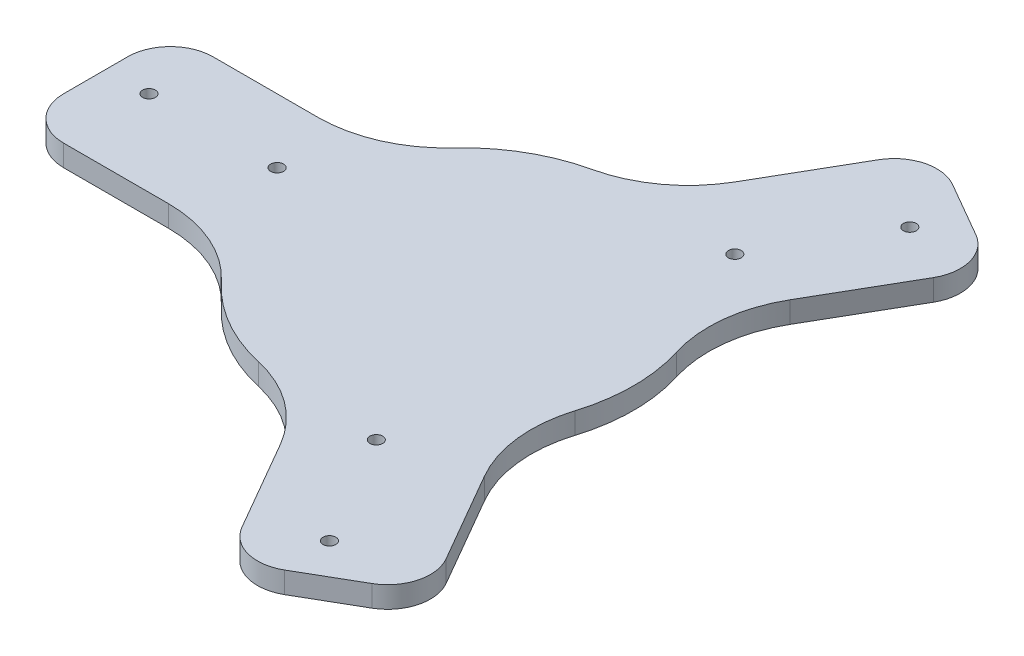
ISO-10303-21;
HEADER;
FILE_DESCRIPTION(('STEP AP214'),'2;1');
FILE_NAME('part.step','',(''),(''),'','','');
FILE_SCHEMA(('AUTOMOTIVE_DESIGN { 1 0 10303 214 1 1 1 1 }'));
ENDSEC;
DATA;
#1=APPLICATION_CONTEXT('core data for automotive mechanical design processes');
#2=APPLICATION_PROTOCOL_DEFINITION('international standard','automotive_design',2000,#1);
#3=PRODUCT_CONTEXT('',#1,'mechanical');
#4=PRODUCT('Part','Part','',(#3));
#5=PRODUCT_RELATED_PRODUCT_CATEGORY('part','',(#4));
#6=PRODUCT_DEFINITION_FORMATION('','',#4);
#7=PRODUCT_DEFINITION_CONTEXT('part definition',#1,'design');
#8=PRODUCT_DEFINITION('design','',#6,#7);
#9=PRODUCT_DEFINITION_SHAPE('','',#8);
#10=(LENGTH_UNIT() NAMED_UNIT(*) SI_UNIT(.MILLI.,.METRE.));
#11=(NAMED_UNIT(*) PLANE_ANGLE_UNIT() SI_UNIT($,.RADIAN.));
#12=(NAMED_UNIT(*) SI_UNIT($,.STERADIAN.) SOLID_ANGLE_UNIT());
#13=UNCERTAINTY_MEASURE_WITH_UNIT(LENGTH_MEASURE(1.E-05),#10,'distance_accuracy_value','');
#14=(GEOMETRIC_REPRESENTATION_CONTEXT(3) GLOBAL_UNCERTAINTY_ASSIGNED_CONTEXT((#13)) GLOBAL_UNIT_ASSIGNED_CONTEXT((#10,
#11,#12)) REPRESENTATION_CONTEXT('',''));
#15=CARTESIAN_POINT('',(0.,0.,0.));
#16=DIRECTION('',(0.,0.,1.));
#17=DIRECTION('',(1.,0.,0.));
#18=AXIS2_PLACEMENT_3D('',#15,#16,#17);
#19=CARTESIAN_POINT('',(-75.9687364248454,5.,7.5));
#20=DIRECTION('',(0.,-1.,0.));
#21=DIRECTION('',(0.,0.,-1.));
#22=AXIS2_PLACEMENT_3D('',#19,#20,#21);
#23=PLANE('',#22);
#24=CARTESIAN_POINT('',(-75.9687364248454,5.,7.5));
#25=DIRECTION('',(0.,1.,0.));
#26=DIRECTION('',(0.,0.,-1.));
#27=AXIS2_PLACEMENT_3D('',#24,#25,#26);
#28=CIRCLE('',#27,10.);
#29=CARTESIAN_POINT('',(-85.9687364248454,5.,7.5));
#30=VERTEX_POINT('',#29);
#31=CARTESIAN_POINT('',(-75.9687364248454,5.,17.5));
#32=VERTEX_POINT('',#31);
#33=EDGE_CURVE('E276',#30,#32,#28,.T.);
#34=ORIENTED_EDGE('',*,*,#33,.T.);
#35=DIRECTION('',(1.,0.,0.));
#36=VECTOR('',#35,1.);
#37=CARTESIAN_POINT('',(-51.4174095030078,5.,17.5));
#38=LINE('',#37,#36);
#39=CARTESIAN_POINT('',(-51.4174095030078,5.,17.5));
#40=VERTEX_POINT('',#39);
#41=EDGE_CURVE('E144',#32,#40,#38,.T.);
#42=ORIENTED_EDGE('',*,*,#41,.T.);
#43=CARTESIAN_POINT('',(-51.4174095030078,5.,47.5));
#44=DIRECTION('',(0.,-1.,0.));
#45=DIRECTION('',(0.,0.,1.));
#46=AXIS2_PLACEMENT_3D('',#43,#44,#45);
#47=CIRCLE('',#46,30.);
#48=CARTESIAN_POINT('',(-29.3813768588616,5.,27.1428571428571));
#49=VERTEX_POINT('',#48);
#50=EDGE_CURVE('E339',#40,#49,#47,.T.);
#51=ORIENTED_EDGE('',*,*,#50,.T.);
#52=CARTESIAN_POINT('',(0.,5.,0.));
#53=DIRECTION('',(0.,1.,0.));
#54=DIRECTION('',(0.,0.,1.));
#55=AXIS2_PLACEMENT_3D('',#52,#53,#54);
#56=CIRCLE('',#55,40.);
#57=CARTESIAN_POINT('',(-8.81571538757538,5.,39.016447329367));
#58=VERTEX_POINT('',#57);
#59=EDGE_CURVE('E358',#49,#58,#56,.T.);
#60=ORIENTED_EDGE('',*,*,#59,.T.);
#61=CARTESIAN_POINT('',(-15.4275019282569,5.,68.2787828263922));
#62=DIRECTION('',(0.,-1.,0.));
#63=DIRECTION('',(0.,0.,-1.));
#64=AXIS2_PLACEMENT_3D('',#61,#62,#63);
#65=CIRCLE('',#64,30.);
#66=CARTESIAN_POINT('',(10.5532601852763,5.,53.2787828263922));
#67=VERTEX_POINT('',#66);
#68=EDGE_CURVE('E355',#58,#67,#65,.T.);
#69=ORIENTED_EDGE('',*,*,#68,.T.);
#70=DIRECTION('',(0.500000000000001,0.,0.866025403784438));
#71=VECTOR('',#70,1.);
#72=CARTESIAN_POINT('',(10.5532601852763,5.,53.2787828263922));
#73=LINE('',#72,#71);
#74=CARTESIAN_POINT('',(22.8289236461951,5.,74.5408556373203));
#75=VERTEX_POINT('',#74);
#76=EDGE_CURVE('E357',#67,#75,#73,.T.);
#77=ORIENTED_EDGE('',*,*,#76,.T.);
#78=CARTESIAN_POINT('',(31.4891776840394,5.,69.5408556373203));
#79=DIRECTION('',(0.,1.,0.));
#80=DIRECTION('',(0.,0.,1.));
#81=AXIS2_PLACEMENT_3D('',#78,#79,#80);
#82=CIRCLE('',#81,10.);
#83=CARTESIAN_POINT('',(36.4891776840394,5.,78.2011096751647));
#84=VERTEX_POINT('',#83);
#85=EDGE_CURVE('E360',#75,#84,#82,.T.);
#86=ORIENTED_EDGE('',*,*,#85,.T.);
#87=DIRECTION('',(0.866025403784439,0.,-0.5));
#88=VECTOR('',#87,1.);
#89=CARTESIAN_POINT('',(49.479558740806,5.,70.7011096751647));
#90=LINE('',#89,#88);
#91=CARTESIAN_POINT('',(49.479558740806,5.,70.7011096751647));
#92=VERTEX_POINT('',#91);
#93=EDGE_CURVE('E366',#84,#92,#90,.T.);
#94=ORIENTED_EDGE('',*,*,#93,.T.);
#95=CARTESIAN_POINT('',(44.479558740806,5.,62.0408556373203));
#96=DIRECTION('',(0.,1.,0.));
#97=DIRECTION('',(0.,0.,-1.));
#98=AXIS2_PLACEMENT_3D('',#95,#96,#97);
#99=CIRCLE('',#98,9.99999999999999);
#100=CARTESIAN_POINT('',(53.1398127786504,5.,57.0408556373203));
#101=VERTEX_POINT('',#100);
#102=EDGE_CURVE('E368',#92,#101,#99,.T.);
#103=ORIENTED_EDGE('',*,*,#102,.T.);
#104=DIRECTION('',(-0.5,0.,-0.866025403784439));
#105=VECTOR('',#104,1.);
#106=CARTESIAN_POINT('',(40.8641493177316,5.,35.7787828263922));
#107=LINE('',#106,#105);
#108=CARTESIAN_POINT('',(40.8641493177316,5.,35.7787828263922));
#109=VERTEX_POINT('',#108);
#110=EDGE_CURVE('E370',#101,#109,#107,.T.);
#111=ORIENTED_EDGE('',*,*,#110,.T.);
#112=CARTESIAN_POINT('',(66.8449114312648,5.,20.7787828263922));
#113=DIRECTION('',(0.,-1.,0.));
#114=DIRECTION('',(0.,0.,1.));
#115=AXIS2_PLACEMENT_3D('',#112,#113,#114);
#116=CIRCLE('',#115,30.);
#117=CARTESIAN_POINT('',(38.197092246437,5.,11.8735901865098));
#118=VERTEX_POINT('',#117);
#119=EDGE_CURVE('E372',#109,#118,#116,.T.);
#120=ORIENTED_EDGE('',*,*,#119,.T.);
#121=CARTESIAN_POINT('',(0.,5.,0.));
#122=DIRECTION('',(0.,1.,0.));
#123=DIRECTION('',(0.,0.,1.));
#124=AXIS2_PLACEMENT_3D('',#121,#122,#123);
#125=CIRCLE('',#124,40.);
#126=CARTESIAN_POINT('',(38.197092246437,5.,-11.8735901865098));
#127=VERTEX_POINT('',#126);
#128=EDGE_CURVE('E374',#118,#127,#125,.T.);
#129=ORIENTED_EDGE('',*,*,#128,.T.);
#130=CARTESIAN_POINT('',(66.8449114312647,5.,-20.7787828263922));
#131=DIRECTION('',(0.,-1.,0.));
#132=DIRECTION('',(0.,0.,-1.));
#133=AXIS2_PLACEMENT_3D('',#130,#131,#132);
#134=CIRCLE('',#133,30.);
#135=CARTESIAN_POINT('',(40.8641493177316,5.,-35.7787828263922));
#136=VERTEX_POINT('',#135);
#137=EDGE_CURVE('E376',#127,#136,#134,.T.);
#138=ORIENTED_EDGE('',*,*,#137,.T.);
#139=DIRECTION('',(0.5,0.,-0.866025403784439));
#140=VECTOR('',#139,1.);
#141=CARTESIAN_POINT('',(40.8641493177316,5.,-35.7787828263922));
#142=LINE('',#141,#140);
#143=CARTESIAN_POINT('',(53.1398127786504,5.,-57.0408556373203));
#144=VERTEX_POINT('',#143);
#145=EDGE_CURVE('E378',#136,#144,#142,.T.);
#146=ORIENTED_EDGE('',*,*,#145,.T.);
#147=CARTESIAN_POINT('',(44.479558740806,5.,-62.0408556373203));
#148=DIRECTION('',(0.,1.,0.));
#149=DIRECTION('',(0.,0.,1.));
#150=AXIS2_PLACEMENT_3D('',#147,#148,#149);
#151=CIRCLE('',#150,9.99999999999999);
#152=CARTESIAN_POINT('',(49.479558740806,5.,-70.7011096751647));
#153=VERTEX_POINT('',#152);
#154=EDGE_CURVE('E380',#144,#153,#151,.T.);
#155=ORIENTED_EDGE('',*,*,#154,.T.);
#156=DIRECTION('',(-0.866025403784439,0.,-0.5));
#157=VECTOR('',#156,1.);
#158=CARTESIAN_POINT('',(36.4891776840394,5.,-78.2011096751647));
#159=LINE('',#158,#157);
#160=CARTESIAN_POINT('',(36.4891776840394,5.,-78.2011096751647));
#161=VERTEX_POINT('',#160);
#162=EDGE_CURVE('E382',#153,#161,#159,.T.);
#163=ORIENTED_EDGE('',*,*,#162,.T.);
#164=CARTESIAN_POINT('',(31.4891776840394,5.,-69.5408556373203));
#165=DIRECTION('',(0.,1.,0.));
#166=DIRECTION('',(0.,0.,-1.));
#167=AXIS2_PLACEMENT_3D('',#164,#165,#166);
#168=CIRCLE('',#167,9.99999999999999);
#169=CARTESIAN_POINT('',(22.828923646195,5.,-74.5408556373203));
#170=VERTEX_POINT('',#169);
#171=EDGE_CURVE('E384',#161,#170,#168,.T.);
#172=ORIENTED_EDGE('',*,*,#171,.T.);
#173=DIRECTION('',(-0.5,0.,0.866025403784439));
#174=VECTOR('',#173,1.);
#175=CARTESIAN_POINT('',(10.5532601852762,5.,-53.2787828263922));
#176=LINE('',#175,#174);
#177=CARTESIAN_POINT('',(10.5532601852762,5.,-53.2787828263922));
#178=VERTEX_POINT('',#177);
#179=EDGE_CURVE('E386',#170,#178,#176,.T.);
#180=ORIENTED_EDGE('',*,*,#179,.T.);
#181=CARTESIAN_POINT('',(-15.4275019282569,5.,-68.2787828263922));
#182=DIRECTION('',(0.,-1.,0.));
#183=DIRECTION('',(0.,0.,1.));
#184=AXIS2_PLACEMENT_3D('',#181,#182,#183);
#185=CIRCLE('',#184,30.);
#186=CARTESIAN_POINT('',(-8.8157153875754,5.,-39.016447329367));
#187=VERTEX_POINT('',#186);
#188=EDGE_CURVE('E388',#178,#187,#185,.T.);
#189=ORIENTED_EDGE('',*,*,#188,.T.);
#190=CARTESIAN_POINT('',(0.,5.,0.));
#191=DIRECTION('',(0.,1.,0.));
#192=DIRECTION('',(0.,0.,1.));
#193=AXIS2_PLACEMENT_3D('',#190,#191,#192);
#194=CIRCLE('',#193,40.);
#195=CARTESIAN_POINT('',(-29.3813768588616,5.,-27.1428571428572));
#196=VERTEX_POINT('',#195);
#197=EDGE_CURVE('E390',#187,#196,#194,.T.);
#198=ORIENTED_EDGE('',*,*,#197,.T.);
#199=CARTESIAN_POINT('',(-51.4174095030078,5.,-47.5));
#200=DIRECTION('',(0.,-1.,0.));
#201=DIRECTION('',(0.,0.,-1.));
#202=AXIS2_PLACEMENT_3D('',#199,#200,#201);
#203=CIRCLE('',#202,30.);
#204=CARTESIAN_POINT('',(-51.4174095030078,5.,-17.5));
#205=VERTEX_POINT('',#204);
#206=EDGE_CURVE('E211',#196,#205,#203,.T.);
#207=ORIENTED_EDGE('',*,*,#206,.T.);
#208=DIRECTION('',(-1.,0.,0.));
#209=VECTOR('',#208,1.);
#210=CARTESIAN_POINT('',(-51.4174095030078,5.,-17.5));
#211=LINE('',#210,#209);
#212=CARTESIAN_POINT('',(-75.9687364248454,5.,-17.5));
#213=VERTEX_POINT('',#212);
#214=EDGE_CURVE('E205',#205,#213,#211,.T.);
#215=ORIENTED_EDGE('',*,*,#214,.T.);
#216=CARTESIAN_POINT('',(-75.9687364248454,5.,-7.5));
#217=DIRECTION('',(0.,1.,0.));
#218=DIRECTION('',(0.,0.,1.));
#219=AXIS2_PLACEMENT_3D('',#216,#217,#218);
#220=CIRCLE('',#219,10.);
#221=CARTESIAN_POINT('',(-85.9687364248454,5.,-7.5));
#222=VERTEX_POINT('',#221);
#223=EDGE_CURVE('E209',#213,#222,#220,.T.);
#224=ORIENTED_EDGE('',*,*,#223,.T.);
#225=DIRECTION('',(0.,0.,1.));
#226=VECTOR('',#225,1.);
#227=CARTESIAN_POINT('',(-85.9687364248454,5.,7.5));
#228=LINE('',#227,#226);
#229=EDGE_CURVE('E53',#222,#30,#228,.T.);
#230=ORIENTED_EDGE('',*,*,#229,.T.);
#231=EDGE_LOOP('',(#34,#42,#51,#60,#69,#77,#86,#94,#103,#111,#120,#129,#138,#146,#155,#163,#172,
#180,#189,#198,#207,#215,#224,#230));
#232=FACE_BOUND('',#231,.T.);
#233=CARTESIAN_POINT('',(-75.9687364248454,5.,-2.5));
#234=DIRECTION('',(0.,1.,0.));
#235=DIRECTION('',(0.,0.,1.));
#236=AXIS2_PLACEMENT_3D('',#233,#234,#235);
#237=CIRCLE('',#236,1.5);
#238=CARTESIAN_POINT('',(-75.9687364248454,5.,-1.00000000000001));
#239=VERTEX_POINT('',#238);
#240=EDGE_CURVE('E233',#239,#239,#237,.T.);
#241=ORIENTED_EDGE('',*,*,#240,.F.);
#242=EDGE_LOOP('',(#241));
#243=FACE_BOUND('',#242,.T.);
#244=CARTESIAN_POINT('',(-45.9687364248454,5.,-2.50000000000001));
#245=DIRECTION('',(0.,1.,0.));
#246=DIRECTION('',(0.,0.,1.));
#247=AXIS2_PLACEMENT_3D('',#244,#245,#246);
#248=CIRCLE('',#247,1.5);
#249=CARTESIAN_POINT('',(-45.9687364248454,5.,-1.));
#250=VERTEX_POINT('',#249);
#251=EDGE_CURVE('E474',#250,#250,#248,.T.);
#252=ORIENTED_EDGE('',*,*,#251,.F.);
#253=EDGE_LOOP('',(#252));
#254=FACE_BOUND('',#253,.T.);
#255=CARTESIAN_POINT('',(40.1494317218838,5.,-64.5408556373203));
#256=DIRECTION('',(0.,1.,0.));
#257=DIRECTION('',(0.,0.,1.));
#258=AXIS2_PLACEMENT_3D('',#255,#256,#257);
#259=CIRCLE('',#258,1.50000000000012);
#260=CARTESIAN_POINT('',(40.1494317218838,5.,-63.0408556373202));
#261=VERTEX_POINT('',#260);
#262=EDGE_CURVE('E468',#261,#261,#259,.T.);
#263=ORIENTED_EDGE('',*,*,#262,.F.);
#264=EDGE_LOOP('',(#263));
#265=FACE_BOUND('',#264,.T.);
#266=CARTESIAN_POINT('',(25.1494317218838,5.,-38.5600935237872));
#267=DIRECTION('',(0.,1.,0.));
#268=DIRECTION('',(0.,0.,1.));
#269=AXIS2_PLACEMENT_3D('',#266,#267,#268);
#270=CIRCLE('',#269,1.50000000000008);
#271=CARTESIAN_POINT('',(25.1494317218838,5.,-37.0600935237871));
#272=VERTEX_POINT('',#271);
#273=EDGE_CURVE('E462',#272,#272,#270,.T.);
#274=ORIENTED_EDGE('',*,*,#273,.F.);
#275=EDGE_LOOP('',(#274));
#276=FACE_BOUND('',#275,.T.);
#277=CARTESIAN_POINT('',(35.8193047029616,5.,67.0408556373203));
#278=DIRECTION('',(0.,1.,0.));
#279=DIRECTION('',(0.,0.,1.));
#280=AXIS2_PLACEMENT_3D('',#277,#278,#279);
#281=CIRCLE('',#280,1.50000000000025);
#282=CARTESIAN_POINT('',(35.8193047029616,5.,68.5408556373206));
#283=VERTEX_POINT('',#282);
#284=EDGE_CURVE('E456',#283,#283,#281,.T.);
#285=ORIENTED_EDGE('',*,*,#284,.F.);
#286=EDGE_LOOP('',(#285));
#287=FACE_BOUND('',#286,.T.);
#288=CARTESIAN_POINT('',(20.8193047029616,5.,41.0600935237872));
#289=DIRECTION('',(0.,1.,0.));
#290=DIRECTION('',(0.,0.,1.));
#291=AXIS2_PLACEMENT_3D('',#288,#289,#290);
#292=CIRCLE('',#291,1.50000000000017);
#293=CARTESIAN_POINT('',(20.8193047029616,5.,42.5600935237873));
#294=VERTEX_POINT('',#293);
#295=EDGE_CURVE('E447',#294,#294,#292,.T.);
#296=ORIENTED_EDGE('',*,*,#295,.F.);
#297=EDGE_LOOP('',(#296));
#298=FACE_BOUND('',#297,.T.);
#299=ADVANCED_FACE('F36',(#232,#243,#254,#265,#276,#287,#298),#23,.F.);
#300=CARTESIAN_POINT('',(-75.9687364248454,0.,7.5));
#301=DIRECTION('',(0.,-1.,0.));
#302=DIRECTION('',(0.,0.,-1.));
#303=AXIS2_PLACEMENT_3D('',#300,#301,#302);
#304=PLANE('',#303);
#305=CARTESIAN_POINT('',(35.8193047029616,0.,67.0408556373203));
#306=DIRECTION('',(0.,1.,0.));
#307=DIRECTION('',(0.,0.,1.));
#308=AXIS2_PLACEMENT_3D('',#305,#306,#307);
#309=CIRCLE('',#308,1.50000000000025);
#310=CARTESIAN_POINT('',(35.8193047029616,0.,68.5408556373206));
#311=VERTEX_POINT('',#310);
#312=EDGE_CURVE('E453',#311,#311,#309,.T.);
#313=ORIENTED_EDGE('',*,*,#312,.T.);
#314=EDGE_LOOP('',(#313));
#315=FACE_BOUND('',#314,.T.);
#316=CARTESIAN_POINT('',(40.1494317218838,0.,-64.5408556373203));
#317=DIRECTION('',(0.,1.,0.));
#318=DIRECTION('',(0.,0.,1.));
#319=AXIS2_PLACEMENT_3D('',#316,#317,#318);
#320=CIRCLE('',#319,1.50000000000012);
#321=CARTESIAN_POINT('',(40.1494317218838,0.,-63.0408556373202));
#322=VERTEX_POINT('',#321);
#323=EDGE_CURVE('E465',#322,#322,#320,.T.);
#324=ORIENTED_EDGE('',*,*,#323,.T.);
#325=EDGE_LOOP('',(#324));
#326=FACE_BOUND('',#325,.T.);
#327=CARTESIAN_POINT('',(-75.9687364248454,0.,-2.5));
#328=DIRECTION('',(0.,1.,0.));
#329=DIRECTION('',(0.,0.,1.));
#330=AXIS2_PLACEMENT_3D('',#327,#328,#329);
#331=CIRCLE('',#330,1.5);
#332=CARTESIAN_POINT('',(-75.9687364248454,0.,-1.00000000000001));
#333=VERTEX_POINT('',#332);
#334=EDGE_CURVE('E477',#333,#333,#331,.T.);
#335=ORIENTED_EDGE('',*,*,#334,.T.);
#336=EDGE_LOOP('',(#335));
#337=FACE_BOUND('',#336,.T.);
#338=CARTESIAN_POINT('',(-75.9687364248454,0.,7.5));
#339=DIRECTION('',(0.,1.,0.));
#340=DIRECTION('',(0.,0.,-1.));
#341=AXIS2_PLACEMENT_3D('',#338,#339,#340);
#342=CIRCLE('',#341,10.);
#343=CARTESIAN_POINT('',(-85.9687364248454,0.,7.5));
#344=VERTEX_POINT('',#343);
#345=CARTESIAN_POINT('',(-75.9687364248454,0.,17.5));
#346=VERTEX_POINT('',#345);
#347=EDGE_CURVE('E229',#344,#346,#342,.T.);
#348=ORIENTED_EDGE('',*,*,#347,.F.);
#349=DIRECTION('',(0.,0.,1.));
#350=VECTOR('',#349,1.);
#351=CARTESIAN_POINT('',(-85.9687364248454,0.,7.5));
#352=LINE('',#351,#350);
#353=CARTESIAN_POINT('',(-85.9687364248454,0.,-7.5));
#354=VERTEX_POINT('',#353);
#355=EDGE_CURVE('E136',#354,#344,#352,.T.);
#356=ORIENTED_EDGE('',*,*,#355,.F.);
#357=CARTESIAN_POINT('',(-75.9687364248454,0.,-7.5));
#358=DIRECTION('',(0.,1.,0.));
#359=DIRECTION('',(0.,0.,1.));
#360=AXIS2_PLACEMENT_3D('',#357,#358,#359);
#361=CIRCLE('',#360,10.);
#362=CARTESIAN_POINT('',(-75.9687364248454,0.,-17.5));
#363=VERTEX_POINT('',#362);
#364=EDGE_CURVE('E130',#363,#354,#361,.T.);
#365=ORIENTED_EDGE('',*,*,#364,.F.);
#366=DIRECTION('',(-1.,0.,0.));
#367=VECTOR('',#366,1.);
#368=CARTESIAN_POINT('',(-51.4174095030078,0.,-17.5));
#369=LINE('',#368,#367);
#370=CARTESIAN_POINT('',(-51.4174095030078,0.,-17.5));
#371=VERTEX_POINT('',#370);
#372=EDGE_CURVE('E219',#371,#363,#369,.T.);
#373=ORIENTED_EDGE('',*,*,#372,.F.);
#374=CARTESIAN_POINT('',(-51.4174095030078,0.,-47.5));
#375=DIRECTION('',(0.,-1.,0.));
#376=DIRECTION('',(0.,0.,-1.));
#377=AXIS2_PLACEMENT_3D('',#374,#375,#376);
#378=CIRCLE('',#377,30.);
#379=CARTESIAN_POINT('',(-29.3813768588616,0.,-27.1428571428572));
#380=VERTEX_POINT('',#379);
#381=EDGE_CURVE('E271',#380,#371,#378,.T.);
#382=ORIENTED_EDGE('',*,*,#381,.F.);
#383=CARTESIAN_POINT('',(0.,0.,0.));
#384=DIRECTION('',(0.,1.,0.));
#385=DIRECTION('',(0.,0.,1.));
#386=AXIS2_PLACEMENT_3D('',#383,#384,#385);
#387=CIRCLE('',#386,40.);
#388=CARTESIAN_POINT('',(-8.8157153875754,0.,-39.016447329367));
#389=VERTEX_POINT('',#388);
#390=EDGE_CURVE('E269',#389,#380,#387,.T.);
#391=ORIENTED_EDGE('',*,*,#390,.F.);
#392=CARTESIAN_POINT('',(-15.4275019282569,0.,-68.2787828263922));
#393=DIRECTION('',(0.,-1.,0.));
#394=DIRECTION('',(0.,0.,1.));
#395=AXIS2_PLACEMENT_3D('',#392,#393,#394);
#396=CIRCLE('',#395,30.);
#397=CARTESIAN_POINT('',(10.5532601852762,0.,-53.2787828263922));
#398=VERTEX_POINT('',#397);
#399=EDGE_CURVE('E267',#398,#389,#396,.T.);
#400=ORIENTED_EDGE('',*,*,#399,.F.);
#401=DIRECTION('',(-0.5,0.,0.866025403784439));
#402=VECTOR('',#401,1.);
#403=CARTESIAN_POINT('',(10.5532601852762,0.,-53.2787828263922));
#404=LINE('',#403,#402);
#405=CARTESIAN_POINT('',(22.828923646195,0.,-74.5408556373203));
#406=VERTEX_POINT('',#405);
#407=EDGE_CURVE('E265',#406,#398,#404,.T.);
#408=ORIENTED_EDGE('',*,*,#407,.F.);
#409=CARTESIAN_POINT('',(31.4891776840394,0.,-69.5408556373203));
#410=DIRECTION('',(0.,1.,0.));
#411=DIRECTION('',(0.,0.,-1.));
#412=AXIS2_PLACEMENT_3D('',#409,#410,#411);
#413=CIRCLE('',#412,9.99999999999999);
#414=CARTESIAN_POINT('',(36.4891776840394,0.,-78.2011096751647));
#415=VERTEX_POINT('',#414);
#416=EDGE_CURVE('E263',#415,#406,#413,.T.);
#417=ORIENTED_EDGE('',*,*,#416,.F.);
#418=DIRECTION('',(-0.866025403784439,0.,-0.5));
#419=VECTOR('',#418,1.);
#420=CARTESIAN_POINT('',(36.4891776840394,0.,-78.2011096751647));
#421=LINE('',#420,#419);
#422=CARTESIAN_POINT('',(49.479558740806,0.,-70.7011096751647));
#423=VERTEX_POINT('',#422);
#424=EDGE_CURVE('E261',#423,#415,#421,.T.);
#425=ORIENTED_EDGE('',*,*,#424,.F.);
#426=CARTESIAN_POINT('',(44.479558740806,0.,-62.0408556373203));
#427=DIRECTION('',(0.,1.,0.));
#428=DIRECTION('',(0.,0.,1.));
#429=AXIS2_PLACEMENT_3D('',#426,#427,#428);
#430=CIRCLE('',#429,9.99999999999999);
#431=CARTESIAN_POINT('',(53.1398127786504,0.,-57.0408556373203));
#432=VERTEX_POINT('',#431);
#433=EDGE_CURVE('E259',#432,#423,#430,.T.);
#434=ORIENTED_EDGE('',*,*,#433,.F.);
#435=DIRECTION('',(0.5,0.,-0.866025403784439));
#436=VECTOR('',#435,1.);
#437=CARTESIAN_POINT('',(40.8641493177316,0.,-35.7787828263922));
#438=LINE('',#437,#436);
#439=CARTESIAN_POINT('',(40.8641493177316,0.,-35.7787828263922));
#440=VERTEX_POINT('',#439);
#441=EDGE_CURVE('E257',#440,#432,#438,.T.);
#442=ORIENTED_EDGE('',*,*,#441,.F.);
#443=CARTESIAN_POINT('',(66.8449114312647,0.,-20.7787828263922));
#444=DIRECTION('',(0.,-1.,0.));
#445=DIRECTION('',(0.,0.,-1.));
#446=AXIS2_PLACEMENT_3D('',#443,#444,#445);
#447=CIRCLE('',#446,30.);
#448=CARTESIAN_POINT('',(38.197092246437,0.,-11.8735901865098));
#449=VERTEX_POINT('',#448);
#450=EDGE_CURVE('E255',#449,#440,#447,.T.);
#451=ORIENTED_EDGE('',*,*,#450,.F.);
#452=CARTESIAN_POINT('',(0.,0.,0.));
#453=DIRECTION('',(0.,1.,0.));
#454=DIRECTION('',(0.,0.,1.));
#455=AXIS2_PLACEMENT_3D('',#452,#453,#454);
#456=CIRCLE('',#455,40.);
#457=CARTESIAN_POINT('',(38.197092246437,0.,11.8735901865098));
#458=VERTEX_POINT('',#457);
#459=EDGE_CURVE('E253',#458,#449,#456,.T.);
#460=ORIENTED_EDGE('',*,*,#459,.F.);
#461=CARTESIAN_POINT('',(66.8449114312648,0.,20.7787828263922));
#462=DIRECTION('',(0.,-1.,0.));
#463=DIRECTION('',(0.,0.,1.));
#464=AXIS2_PLACEMENT_3D('',#461,#462,#463);
#465=CIRCLE('',#464,30.);
#466=CARTESIAN_POINT('',(40.8641493177316,0.,35.7787828263922));
#467=VERTEX_POINT('',#466);
#468=EDGE_CURVE('E251',#467,#458,#465,.T.);
#469=ORIENTED_EDGE('',*,*,#468,.F.);
#470=DIRECTION('',(-0.5,0.,-0.866025403784439));
#471=VECTOR('',#470,1.);
#472=CARTESIAN_POINT('',(40.8641493177316,0.,35.7787828263922));
#473=LINE('',#472,#471);
#474=CARTESIAN_POINT('',(53.1398127786504,0.,57.0408556373203));
#475=VERTEX_POINT('',#474);
#476=EDGE_CURVE('E249',#475,#467,#473,.T.);
#477=ORIENTED_EDGE('',*,*,#476,.F.);
#478=CARTESIAN_POINT('',(44.479558740806,0.,62.0408556373203));
#479=DIRECTION('',(0.,1.,0.));
#480=DIRECTION('',(0.,0.,-1.));
#481=AXIS2_PLACEMENT_3D('',#478,#479,#480);
#482=CIRCLE('',#481,9.99999999999999);
#483=CARTESIAN_POINT('',(49.479558740806,0.,70.7011096751647));
#484=VERTEX_POINT('',#483);
#485=EDGE_CURVE('E247',#484,#475,#482,.T.);
#486=ORIENTED_EDGE('',*,*,#485,.F.);
#487=DIRECTION('',(0.866025403784439,0.,-0.5));
#488=VECTOR('',#487,1.);
#489=CARTESIAN_POINT('',(49.479558740806,0.,70.7011096751647));
#490=LINE('',#489,#488);
#491=CARTESIAN_POINT('',(36.4891776840394,0.,78.2011096751647));
#492=VERTEX_POINT('',#491);
#493=EDGE_CURVE('E245',#492,#484,#490,.T.);
#494=ORIENTED_EDGE('',*,*,#493,.F.);
#495=CARTESIAN_POINT('',(31.4891776840394,0.,69.5408556373203));
#496=DIRECTION('',(0.,1.,0.));
#497=DIRECTION('',(0.,0.,1.));
#498=AXIS2_PLACEMENT_3D('',#495,#496,#497);
#499=CIRCLE('',#498,10.);
#500=CARTESIAN_POINT('',(22.8289236461951,0.,74.5408556373203));
#501=VERTEX_POINT('',#500);
#502=EDGE_CURVE('E243',#501,#492,#499,.T.);
#503=ORIENTED_EDGE('',*,*,#502,.F.);
#504=DIRECTION('',(0.500000000000001,0.,0.866025403784438));
#505=VECTOR('',#504,1.);
#506=CARTESIAN_POINT('',(10.5532601852763,0.,53.2787828263922));
#507=LINE('',#506,#505);
#508=CARTESIAN_POINT('',(10.5532601852763,0.,53.2787828263922));
#509=VERTEX_POINT('',#508);
#510=EDGE_CURVE('E241',#509,#501,#507,.T.);
#511=ORIENTED_EDGE('',*,*,#510,.F.);
#512=CARTESIAN_POINT('',(-15.4275019282569,0.,68.2787828263922));
#513=DIRECTION('',(0.,-1.,0.));
#514=DIRECTION('',(0.,0.,-1.));
#515=AXIS2_PLACEMENT_3D('',#512,#513,#514);
#516=CIRCLE('',#515,30.);
#517=CARTESIAN_POINT('',(-8.81571538757538,0.,39.016447329367));
#518=VERTEX_POINT('',#517);
#519=EDGE_CURVE('E239',#518,#509,#516,.T.);
#520=ORIENTED_EDGE('',*,*,#519,.F.);
#521=CARTESIAN_POINT('',(0.,0.,0.));
#522=DIRECTION('',(0.,1.,0.));
#523=DIRECTION('',(0.,0.,1.));
#524=AXIS2_PLACEMENT_3D('',#521,#522,#523);
#525=CIRCLE('',#524,40.);
#526=CARTESIAN_POINT('',(-29.3813768588616,0.,27.1428571428571));
#527=VERTEX_POINT('',#526);
#528=EDGE_CURVE('E237',#527,#518,#525,.T.);
#529=ORIENTED_EDGE('',*,*,#528,.F.);
#530=CARTESIAN_POINT('',(-51.4174095030078,0.,47.5));
#531=DIRECTION('',(0.,-1.,0.));
#532=DIRECTION('',(0.,0.,1.));
#533=AXIS2_PLACEMENT_3D('',#530,#531,#532);
#534=CIRCLE('',#533,30.);
#535=CARTESIAN_POINT('',(-51.4174095030078,0.,17.5));
#536=VERTEX_POINT('',#535);
#537=EDGE_CURVE('E235',#536,#527,#534,.T.);
#538=ORIENTED_EDGE('',*,*,#537,.F.);
#539=DIRECTION('',(1.,0.,0.));
#540=VECTOR('',#539,1.);
#541=CARTESIAN_POINT('',(-51.4174095030078,0.,17.5));
#542=LINE('',#541,#540);
#543=EDGE_CURVE('E232',#346,#536,#542,.T.);
#544=ORIENTED_EDGE('',*,*,#543,.F.);
#545=EDGE_LOOP('',(#348,#356,#365,#373,#382,#391,#400,#408,#417,#425,#434,#442,#451,#460,#469,
#477,#486,#494,#503,#511,#520,#529,#538,#544));
#546=FACE_BOUND('',#545,.T.);
#547=CARTESIAN_POINT('',(-45.9687364248454,0.,-2.50000000000001));
#548=DIRECTION('',(0.,1.,0.));
#549=DIRECTION('',(0.,0.,1.));
#550=AXIS2_PLACEMENT_3D('',#547,#548,#549);
#551=CIRCLE('',#550,1.5);
#552=CARTESIAN_POINT('',(-45.9687364248454,0.,-1.));
#553=VERTEX_POINT('',#552);
#554=EDGE_CURVE('E471',#553,#553,#551,.T.);
#555=ORIENTED_EDGE('',*,*,#554,.T.);
#556=EDGE_LOOP('',(#555));
#557=FACE_BOUND('',#556,.T.);
#558=CARTESIAN_POINT('',(25.1494317218838,0.,-38.5600935237872));
#559=DIRECTION('',(0.,1.,0.));
#560=DIRECTION('',(0.,0.,1.));
#561=AXIS2_PLACEMENT_3D('',#558,#559,#560);
#562=CIRCLE('',#561,1.50000000000008);
#563=CARTESIAN_POINT('',(25.1494317218838,0.,-37.0600935237871));
#564=VERTEX_POINT('',#563);
#565=EDGE_CURVE('E459',#564,#564,#562,.T.);
#566=ORIENTED_EDGE('',*,*,#565,.T.);
#567=EDGE_LOOP('',(#566));
#568=FACE_BOUND('',#567,.T.);
#569=CARTESIAN_POINT('',(20.8193047029616,0.,41.0600935237872));
#570=DIRECTION('',(0.,1.,0.));
#571=DIRECTION('',(0.,0.,1.));
#572=AXIS2_PLACEMENT_3D('',#569,#570,#571);
#573=CIRCLE('',#572,1.50000000000017);
#574=CARTESIAN_POINT('',(20.8193047029616,0.,42.5600935237873));
#575=VERTEX_POINT('',#574);
#576=EDGE_CURVE('E450',#575,#575,#573,.T.);
#577=ORIENTED_EDGE('',*,*,#576,.T.);
#578=EDGE_LOOP('',(#577));
#579=FACE_BOUND('',#578,.T.);
#580=ADVANCED_FACE('F343',(#315,#326,#337,#546,#557,#568,#579),#304,.T.);
#581=CARTESIAN_POINT('',(-75.9687364248454,5.,7.5));
#582=DIRECTION('',(0.,-1.,0.));
#583=DIRECTION('',(0.,0.,-1.));
#584=AXIS2_PLACEMENT_3D('',#581,#582,#583);
#585=CYLINDRICAL_SURFACE('',#584,10.);
#586=ORIENTED_EDGE('',*,*,#347,.T.);
#587=DIRECTION('',(0.,-1.,0.));
#588=VECTOR('',#587,1.);
#589=CARTESIAN_POINT('',(-75.9687364248454,5.,17.5));
#590=LINE('',#589,#588);
#591=EDGE_CURVE('E11',#32,#346,#590,.T.);
#592=ORIENTED_EDGE('',*,*,#591,.F.);
#593=ORIENTED_EDGE('',*,*,#33,.F.);
#594=DIRECTION('',(0.,-1.,0.));
#595=VECTOR('',#594,1.);
#596=CARTESIAN_POINT('',(-85.9687364248454,5.,7.5));
#597=LINE('',#596,#595);
#598=EDGE_CURVE('E225',#30,#344,#597,.T.);
#599=ORIENTED_EDGE('',*,*,#598,.T.);
#600=EDGE_LOOP('',(#586,#592,#593,#599));
#601=FACE_BOUND('',#600,.T.);
#602=ADVANCED_FACE('F38',(#601),#585,.T.);
#603=CARTESIAN_POINT('',(-51.4174095030078,5.,17.5));
#604=DIRECTION('',(0.,0.,-1.));
#605=DIRECTION('',(-1.,0.,0.));
#606=AXIS2_PLACEMENT_3D('',#603,#604,#605);
#607=PLANE('',#606);
#608=ORIENTED_EDGE('',*,*,#543,.T.);
#609=DIRECTION('',(0.,-1.,0.));
#610=VECTOR('',#609,1.);
#611=CARTESIAN_POINT('',(-51.4174095030078,5.,17.5));
#612=LINE('',#611,#610);
#613=EDGE_CURVE('E45',#40,#536,#612,.T.);
#614=ORIENTED_EDGE('',*,*,#613,.F.);
#615=ORIENTED_EDGE('',*,*,#41,.F.);
#616=ORIENTED_EDGE('',*,*,#591,.T.);
#617=EDGE_LOOP('',(#608,#614,#615,#616));
#618=FACE_BOUND('',#617,.T.);
#619=ADVANCED_FACE('F727',(#618),#607,.F.);
#620=CARTESIAN_POINT('',(-51.4174095030078,5.,47.5));
#621=DIRECTION('',(0.,-1.,0.));
#622=DIRECTION('',(0.,0.,-1.));
#623=AXIS2_PLACEMENT_3D('',#620,#621,#622);
#624=CYLINDRICAL_SURFACE('',#623,30.);
#625=ORIENTED_EDGE('',*,*,#537,.T.);
#626=DIRECTION('',(0.,-1.,0.));
#627=VECTOR('',#626,1.);
#628=CARTESIAN_POINT('',(-29.3813768588616,5.,27.1428571428571));
#629=LINE('',#628,#627);
#630=EDGE_CURVE('E331',#49,#527,#629,.T.);
#631=ORIENTED_EDGE('',*,*,#630,.F.);
#632=ORIENTED_EDGE('',*,*,#50,.F.);
#633=ORIENTED_EDGE('',*,*,#613,.T.);
#634=EDGE_LOOP('',(#625,#631,#632,#633));
#635=FACE_BOUND('',#634,.T.);
#636=ADVANCED_FACE('F337',(#635),#624,.F.);
#637=CARTESIAN_POINT('',(0.,5.,0.));
#638=DIRECTION('',(0.,-1.,0.));
#639=DIRECTION('',(0.,0.,-1.));
#640=AXIS2_PLACEMENT_3D('',#637,#638,#639);
#641=CYLINDRICAL_SURFACE('',#640,40.);
#642=ORIENTED_EDGE('',*,*,#528,.T.);
#643=DIRECTION('',(0.,-1.,0.));
#644=VECTOR('',#643,1.);
#645=CARTESIAN_POINT('',(-8.81571538757538,5.,39.016447329367));
#646=LINE('',#645,#644);
#647=EDGE_CURVE('E328',#58,#518,#646,.T.);
#648=ORIENTED_EDGE('',*,*,#647,.F.);
#649=ORIENTED_EDGE('',*,*,#59,.F.);
#650=ORIENTED_EDGE('',*,*,#630,.T.);
#651=EDGE_LOOP('',(#642,#648,#649,#650));
#652=FACE_BOUND('',#651,.T.);
#653=ADVANCED_FACE('F349',(#652),#641,.T.);
#654=CARTESIAN_POINT('',(-15.4275019282569,5.,68.2787828263922));
#655=DIRECTION('',(0.,-1.,0.));
#656=DIRECTION('',(0.,0.,-1.));
#657=AXIS2_PLACEMENT_3D('',#654,#655,#656);
#658=CYLINDRICAL_SURFACE('',#657,30.);
#659=ORIENTED_EDGE('',*,*,#519,.T.);
#660=DIRECTION('',(0.,-1.,0.));
#661=VECTOR('',#660,1.);
#662=CARTESIAN_POINT('',(10.5532601852763,5.,53.2787828263922));
#663=LINE('',#662,#661);
#664=EDGE_CURVE('E325',#67,#509,#663,.T.);
#665=ORIENTED_EDGE('',*,*,#664,.F.);
#666=ORIENTED_EDGE('',*,*,#68,.F.);
#667=ORIENTED_EDGE('',*,*,#647,.T.);
#668=EDGE_LOOP('',(#659,#665,#666,#667));
#669=FACE_BOUND('',#668,.T.);
#670=ADVANCED_FACE('F353',(#669),#658,.F.);
#671=CARTESIAN_POINT('',(10.5532601852763,5.,53.2787828263922));
#672=DIRECTION('',(0.866025403784438,0.,-0.500000000000001));
#673=DIRECTION('',(-0.500000000000001,0.,-0.866025403784438));
#674=AXIS2_PLACEMENT_3D('',#671,#672,#673);
#675=PLANE('',#674);
#676=ORIENTED_EDGE('',*,*,#510,.T.);
#677=DIRECTION('',(0.,-1.,0.));
#678=VECTOR('',#677,1.);
#679=CARTESIAN_POINT('',(22.8289236461951,5.,74.5408556373203));
#680=LINE('',#679,#678);
#681=EDGE_CURVE('E322',#75,#501,#680,.T.);
#682=ORIENTED_EDGE('',*,*,#681,.F.);
#683=ORIENTED_EDGE('',*,*,#76,.F.);
#684=ORIENTED_EDGE('',*,*,#664,.T.);
#685=EDGE_LOOP('',(#676,#682,#683,#684));
#686=FACE_BOUND('',#685,.T.);
#687=ADVANCED_FACE('F692',(#686),#675,.F.);
#688=CARTESIAN_POINT('',(31.4891776840394,5.,69.5408556373203));
#689=DIRECTION('',(0.,-1.,0.));
#690=DIRECTION('',(0.,0.,-1.));
#691=AXIS2_PLACEMENT_3D('',#688,#689,#690);
#692=CYLINDRICAL_SURFACE('',#691,10.);
#693=ORIENTED_EDGE('',*,*,#502,.T.);
#694=DIRECTION('',(0.,-1.,0.));
#695=VECTOR('',#694,1.);
#696=CARTESIAN_POINT('',(36.4891776840394,5.,78.2011096751647));
#697=LINE('',#696,#695);
#698=EDGE_CURVE('E319',#84,#492,#697,.T.);
#699=ORIENTED_EDGE('',*,*,#698,.F.);
#700=ORIENTED_EDGE('',*,*,#85,.F.);
#701=ORIENTED_EDGE('',*,*,#681,.T.);
#702=EDGE_LOOP('',(#693,#699,#700,#701));
#703=FACE_BOUND('',#702,.T.);
#704=ADVANCED_FACE('F682',(#703),#692,.T.);
#705=CARTESIAN_POINT('',(49.479558740806,5.,70.7011096751647));
#706=DIRECTION('',(-0.5,0.,-0.866025403784439));
#707=DIRECTION('',(-0.866025403784439,0.,0.5));
#708=AXIS2_PLACEMENT_3D('',#705,#706,#707);
#709=PLANE('',#708);
#710=ORIENTED_EDGE('',*,*,#493,.T.);
#711=DIRECTION('',(0.,-1.,0.));
#712=VECTOR('',#711,1.);
#713=CARTESIAN_POINT('',(49.479558740806,5.,70.7011096751647));
#714=LINE('',#713,#712);
#715=EDGE_CURVE('E316',#92,#484,#714,.T.);
#716=ORIENTED_EDGE('',*,*,#715,.F.);
#717=ORIENTED_EDGE('',*,*,#93,.F.);
#718=ORIENTED_EDGE('',*,*,#698,.T.);
#719=EDGE_LOOP('',(#710,#716,#717,#718));
#720=FACE_BOUND('',#719,.T.);
#721=ADVANCED_FACE('F672',(#720),#709,.F.);
#722=CARTESIAN_POINT('',(44.479558740806,5.,62.0408556373203));
#723=DIRECTION('',(0.,-1.,0.));
#724=DIRECTION('',(0.,0.,-1.));
#725=AXIS2_PLACEMENT_3D('',#722,#723,#724);
#726=CYLINDRICAL_SURFACE('',#725,9.99999999999999);
#727=ORIENTED_EDGE('',*,*,#485,.T.);
#728=DIRECTION('',(0.,-1.,0.));
#729=VECTOR('',#728,1.);
#730=CARTESIAN_POINT('',(53.1398127786504,5.,57.0408556373203));
#731=LINE('',#730,#729);
#732=EDGE_CURVE('E313',#101,#475,#731,.T.);
#733=ORIENTED_EDGE('',*,*,#732,.F.);
#734=ORIENTED_EDGE('',*,*,#102,.F.);
#735=ORIENTED_EDGE('',*,*,#715,.T.);
#736=EDGE_LOOP('',(#727,#733,#734,#735));
#737=FACE_BOUND('',#736,.T.);
#738=ADVANCED_FACE('F662',(#737),#726,.T.);
#739=CARTESIAN_POINT('',(40.8641493177316,5.,35.7787828263922));
#740=DIRECTION('',(-0.866025403784438,0.,0.5));
#741=DIRECTION('',(0.5,0.,0.866025403784439));
#742=AXIS2_PLACEMENT_3D('',#739,#740,#741);
#743=PLANE('',#742);
#744=ORIENTED_EDGE('',*,*,#476,.T.);
#745=DIRECTION('',(0.,-1.,0.));
#746=VECTOR('',#745,1.);
#747=CARTESIAN_POINT('',(40.8641493177316,5.,35.7787828263922));
#748=LINE('',#747,#746);
#749=EDGE_CURVE('E310',#109,#467,#748,.T.);
#750=ORIENTED_EDGE('',*,*,#749,.F.);
#751=ORIENTED_EDGE('',*,*,#110,.F.);
#752=ORIENTED_EDGE('',*,*,#732,.T.);
#753=EDGE_LOOP('',(#744,#750,#751,#752));
#754=FACE_BOUND('',#753,.T.);
#755=ADVANCED_FACE('F652',(#754),#743,.F.);
#756=CARTESIAN_POINT('',(66.8449114312648,5.,20.7787828263922));
#757=DIRECTION('',(0.,-1.,0.));
#758=DIRECTION('',(0.,0.,-1.));
#759=AXIS2_PLACEMENT_3D('',#756,#757,#758);
#760=CYLINDRICAL_SURFACE('',#759,30.);
#761=ORIENTED_EDGE('',*,*,#468,.T.);
#762=DIRECTION('',(0.,-1.,0.));
#763=VECTOR('',#762,1.);
#764=CARTESIAN_POINT('',(38.197092246437,5.,11.8735901865098));
#765=LINE('',#764,#763);
#766=EDGE_CURVE('E307',#118,#458,#765,.T.);
#767=ORIENTED_EDGE('',*,*,#766,.F.);
#768=ORIENTED_EDGE('',*,*,#119,.F.);
#769=ORIENTED_EDGE('',*,*,#749,.T.);
#770=EDGE_LOOP('',(#761,#767,#768,#769));
#771=FACE_BOUND('',#770,.T.);
#772=ADVANCED_FACE('F642',(#771),#760,.F.);
#773=CARTESIAN_POINT('',(0.,5.,0.));
#774=DIRECTION('',(0.,-1.,0.));
#775=DIRECTION('',(0.,0.,-1.));
#776=AXIS2_PLACEMENT_3D('',#773,#774,#775);
#777=CYLINDRICAL_SURFACE('',#776,40.);
#778=ORIENTED_EDGE('',*,*,#459,.T.);
#779=DIRECTION('',(0.,-1.,0.));
#780=VECTOR('',#779,1.);
#781=CARTESIAN_POINT('',(38.197092246437,5.,-11.8735901865098));
#782=LINE('',#781,#780);
#783=EDGE_CURVE('E304',#127,#449,#782,.T.);
#784=ORIENTED_EDGE('',*,*,#783,.F.);
#785=ORIENTED_EDGE('',*,*,#128,.F.);
#786=ORIENTED_EDGE('',*,*,#766,.T.);
#787=EDGE_LOOP('',(#778,#784,#785,#786));
#788=FACE_BOUND('',#787,.T.);
#789=ADVANCED_FACE('F632',(#788),#777,.T.);
#790=CARTESIAN_POINT('',(66.8449114312647,5.,-20.7787828263922));
#791=DIRECTION('',(0.,-1.,0.));
#792=DIRECTION('',(0.,0.,-1.));
#793=AXIS2_PLACEMENT_3D('',#790,#791,#792);
#794=CYLINDRICAL_SURFACE('',#793,30.);
#795=ORIENTED_EDGE('',*,*,#450,.T.);
#796=DIRECTION('',(0.,-1.,0.));
#797=VECTOR('',#796,1.);
#798=CARTESIAN_POINT('',(40.8641493177316,5.,-35.7787828263922));
#799=LINE('',#798,#797);
#800=EDGE_CURVE('E301',#136,#440,#799,.T.);
#801=ORIENTED_EDGE('',*,*,#800,.F.);
#802=ORIENTED_EDGE('',*,*,#137,.F.);
#803=ORIENTED_EDGE('',*,*,#783,.T.);
#804=EDGE_LOOP('',(#795,#801,#802,#803));
#805=FACE_BOUND('',#804,.T.);
#806=ADVANCED_FACE('F622',(#805),#794,.F.);
#807=CARTESIAN_POINT('',(40.8641493177316,5.,-35.7787828263922));
#808=DIRECTION('',(-0.866025403784439,0.,-0.5));
#809=DIRECTION('',(-0.5,0.,0.866025403784439));
#810=AXIS2_PLACEMENT_3D('',#807,#808,#809);
#811=PLANE('',#810);
#812=ORIENTED_EDGE('',*,*,#441,.T.);
#813=DIRECTION('',(0.,-1.,0.));
#814=VECTOR('',#813,1.);
#815=CARTESIAN_POINT('',(53.1398127786504,5.,-57.0408556373203));
#816=LINE('',#815,#814);
#817=EDGE_CURVE('E298',#144,#432,#816,.T.);
#818=ORIENTED_EDGE('',*,*,#817,.F.);
#819=ORIENTED_EDGE('',*,*,#145,.F.);
#820=ORIENTED_EDGE('',*,*,#800,.T.);
#821=EDGE_LOOP('',(#812,#818,#819,#820));
#822=FACE_BOUND('',#821,.T.);
#823=ADVANCED_FACE('F612',(#822),#811,.F.);
#824=CARTESIAN_POINT('',(44.479558740806,5.,-62.0408556373203));
#825=DIRECTION('',(0.,-1.,0.));
#826=DIRECTION('',(0.,0.,-1.));
#827=AXIS2_PLACEMENT_3D('',#824,#825,#826);
#828=CYLINDRICAL_SURFACE('',#827,9.99999999999999);
#829=ORIENTED_EDGE('',*,*,#433,.T.);
#830=DIRECTION('',(0.,-1.,0.));
#831=VECTOR('',#830,1.);
#832=CARTESIAN_POINT('',(49.479558740806,5.,-70.7011096751647));
#833=LINE('',#832,#831);
#834=EDGE_CURVE('E295',#153,#423,#833,.T.);
#835=ORIENTED_EDGE('',*,*,#834,.F.);
#836=ORIENTED_EDGE('',*,*,#154,.F.);
#837=ORIENTED_EDGE('',*,*,#817,.T.);
#838=EDGE_LOOP('',(#829,#835,#836,#837));
#839=FACE_BOUND('',#838,.T.);
#840=ADVANCED_FACE('F602',(#839),#828,.T.);
#841=CARTESIAN_POINT('',(36.4891776840394,5.,-78.2011096751647));
#842=DIRECTION('',(-0.5,0.,0.866025403784439));
#843=DIRECTION('',(0.866025403784439,0.,0.5));
#844=AXIS2_PLACEMENT_3D('',#841,#842,#843);
#845=PLANE('',#844);
#846=ORIENTED_EDGE('',*,*,#424,.T.);
#847=DIRECTION('',(0.,-1.,0.));
#848=VECTOR('',#847,1.);
#849=CARTESIAN_POINT('',(36.4891776840394,5.,-78.2011096751647));
#850=LINE('',#849,#848);
#851=EDGE_CURVE('E292',#161,#415,#850,.T.);
#852=ORIENTED_EDGE('',*,*,#851,.F.);
#853=ORIENTED_EDGE('',*,*,#162,.F.);
#854=ORIENTED_EDGE('',*,*,#834,.T.);
#855=EDGE_LOOP('',(#846,#852,#853,#854));
#856=FACE_BOUND('',#855,.T.);
#857=ADVANCED_FACE('F592',(#856),#845,.F.);
#858=CARTESIAN_POINT('',(31.4891776840394,5.,-69.5408556373203));
#859=DIRECTION('',(0.,-1.,0.));
#860=DIRECTION('',(0.,0.,-1.));
#861=AXIS2_PLACEMENT_3D('',#858,#859,#860);
#862=CYLINDRICAL_SURFACE('',#861,9.99999999999999);
#863=ORIENTED_EDGE('',*,*,#416,.T.);
#864=DIRECTION('',(0.,-1.,0.));
#865=VECTOR('',#864,1.);
#866=CARTESIAN_POINT('',(22.828923646195,5.,-74.5408556373203));
#867=LINE('',#866,#865);
#868=EDGE_CURVE('E289',#170,#406,#867,.T.);
#869=ORIENTED_EDGE('',*,*,#868,.F.);
#870=ORIENTED_EDGE('',*,*,#171,.F.);
#871=ORIENTED_EDGE('',*,*,#851,.T.);
#872=EDGE_LOOP('',(#863,#869,#870,#871));
#873=FACE_BOUND('',#872,.T.);
#874=ADVANCED_FACE('F582',(#873),#862,.T.);
#875=CARTESIAN_POINT('',(10.5532601852762,5.,-53.2787828263922));
#876=DIRECTION('',(0.866025403784439,0.,0.5));
#877=DIRECTION('',(0.5,0.,-0.866025403784439));
#878=AXIS2_PLACEMENT_3D('',#875,#876,#877);
#879=PLANE('',#878);
#880=ORIENTED_EDGE('',*,*,#407,.T.);
#881=DIRECTION('',(0.,-1.,0.));
#882=VECTOR('',#881,1.);
#883=CARTESIAN_POINT('',(10.5532601852762,5.,-53.2787828263922));
#884=LINE('',#883,#882);
#885=EDGE_CURVE('E286',#178,#398,#884,.T.);
#886=ORIENTED_EDGE('',*,*,#885,.F.);
#887=ORIENTED_EDGE('',*,*,#179,.F.);
#888=ORIENTED_EDGE('',*,*,#868,.T.);
#889=EDGE_LOOP('',(#880,#886,#887,#888));
#890=FACE_BOUND('',#889,.T.);
#891=ADVANCED_FACE('F572',(#890),#879,.F.);
#892=CARTESIAN_POINT('',(-15.4275019282569,5.,-68.2787828263922));
#893=DIRECTION('',(0.,-1.,0.));
#894=DIRECTION('',(0.,0.,-1.));
#895=AXIS2_PLACEMENT_3D('',#892,#893,#894);
#896=CYLINDRICAL_SURFACE('',#895,30.);
#897=ORIENTED_EDGE('',*,*,#399,.T.);
#898=DIRECTION('',(0.,-1.,0.));
#899=VECTOR('',#898,1.);
#900=CARTESIAN_POINT('',(-8.8157153875754,5.,-39.016447329367));
#901=LINE('',#900,#899);
#902=EDGE_CURVE('E283',#187,#389,#901,.T.);
#903=ORIENTED_EDGE('',*,*,#902,.F.);
#904=ORIENTED_EDGE('',*,*,#188,.F.);
#905=ORIENTED_EDGE('',*,*,#885,.T.);
#906=EDGE_LOOP('',(#897,#903,#904,#905));
#907=FACE_BOUND('',#906,.T.);
#908=ADVANCED_FACE('F563',(#907),#896,.F.);
#909=CARTESIAN_POINT('',(0.,5.,0.));
#910=DIRECTION('',(0.,-1.,0.));
#911=DIRECTION('',(0.,0.,-1.));
#912=AXIS2_PLACEMENT_3D('',#909,#910,#911);
#913=CYLINDRICAL_SURFACE('',#912,40.);
#914=ORIENTED_EDGE('',*,*,#390,.T.);
#915=DIRECTION('',(0.,-1.,0.));
#916=VECTOR('',#915,1.);
#917=CARTESIAN_POINT('',(-29.3813768588616,5.,-27.1428571428572));
#918=LINE('',#917,#916);
#919=EDGE_CURVE('E280',#196,#380,#918,.T.);
#920=ORIENTED_EDGE('',*,*,#919,.F.);
#921=ORIENTED_EDGE('',*,*,#197,.F.);
#922=ORIENTED_EDGE('',*,*,#902,.T.);
#923=EDGE_LOOP('',(#914,#920,#921,#922));
#924=FACE_BOUND('',#923,.T.);
#925=ADVANCED_FACE('F396',(#924),#913,.T.);
#926=CARTESIAN_POINT('',(-51.4174095030078,5.,-47.5));
#927=DIRECTION('',(0.,-1.,0.));
#928=DIRECTION('',(0.,0.,-1.));
#929=AXIS2_PLACEMENT_3D('',#926,#927,#928);
#930=CYLINDRICAL_SURFACE('',#929,30.);
#931=ORIENTED_EDGE('',*,*,#381,.T.);
#932=DIRECTION('',(0.,-1.,0.));
#933=VECTOR('',#932,1.);
#934=CARTESIAN_POINT('',(-51.4174095030078,5.,-17.5));
#935=LINE('',#934,#933);
#936=EDGE_CURVE('E220',#205,#371,#935,.T.);
#937=ORIENTED_EDGE('',*,*,#936,.F.);
#938=ORIENTED_EDGE('',*,*,#206,.F.);
#939=ORIENTED_EDGE('',*,*,#919,.T.);
#940=EDGE_LOOP('',(#931,#937,#938,#939));
#941=FACE_BOUND('',#940,.T.);
#942=ADVANCED_FACE('F400',(#941),#930,.F.);
#943=CARTESIAN_POINT('',(-51.4174095030078,5.,-17.5));
#944=DIRECTION('',(0.,0.,1.));
#945=DIRECTION('',(1.,0.,0.));
#946=AXIS2_PLACEMENT_3D('',#943,#944,#945);
#947=PLANE('',#946);
#948=ORIENTED_EDGE('',*,*,#372,.T.);
#949=DIRECTION('',(0.,-1.,0.));
#950=VECTOR('',#949,1.);
#951=CARTESIAN_POINT('',(-75.9687364248454,5.,-17.5));
#952=LINE('',#951,#950);
#953=EDGE_CURVE('E216',#213,#363,#952,.T.);
#954=ORIENTED_EDGE('',*,*,#953,.F.);
#955=ORIENTED_EDGE('',*,*,#214,.F.);
#956=ORIENTED_EDGE('',*,*,#936,.T.);
#957=EDGE_LOOP('',(#948,#954,#955,#956));
#958=FACE_BOUND('',#957,.T.);
#959=ADVANCED_FACE('F217',(#958),#947,.F.);
#960=CARTESIAN_POINT('',(-75.9687364248454,5.,-7.5));
#961=DIRECTION('',(0.,-1.,0.));
#962=DIRECTION('',(0.,0.,-1.));
#963=AXIS2_PLACEMENT_3D('',#960,#961,#962);
#964=CYLINDRICAL_SURFACE('',#963,10.);
#965=ORIENTED_EDGE('',*,*,#364,.T.);
#966=DIRECTION('',(0.,-1.,0.));
#967=VECTOR('',#966,1.);
#968=CARTESIAN_POINT('',(-85.9687364248454,5.,-7.5));
#969=LINE('',#968,#967);
#970=EDGE_CURVE('E221',#222,#354,#969,.T.);
#971=ORIENTED_EDGE('',*,*,#970,.F.);
#972=ORIENTED_EDGE('',*,*,#223,.F.);
#973=ORIENTED_EDGE('',*,*,#953,.T.);
#974=EDGE_LOOP('',(#965,#971,#972,#973));
#975=FACE_BOUND('',#974,.T.);
#976=ADVANCED_FACE('F223',(#975),#964,.T.);
#977=CARTESIAN_POINT('',(-85.9687364248454,5.,7.5));
#978=DIRECTION('',(1.,0.,0.));
#979=DIRECTION('',(0.,0.,-1.));
#980=AXIS2_PLACEMENT_3D('',#977,#978,#979);
#981=PLANE('',#980);
#982=ORIENTED_EDGE('',*,*,#355,.T.);
#983=ORIENTED_EDGE('',*,*,#598,.F.);
#984=ORIENTED_EDGE('',*,*,#229,.F.);
#985=ORIENTED_EDGE('',*,*,#970,.T.);
#986=EDGE_LOOP('',(#982,#983,#984,#985));
#987=FACE_BOUND('',#986,.T.);
#988=ADVANCED_FACE('F404',(#987),#981,.F.);
#989=CARTESIAN_POINT('',(-75.9687364248454,5.,-2.5));
#990=DIRECTION('',(0.,-1.,0.));
#991=DIRECTION('',(0.,0.,-1.));
#992=AXIS2_PLACEMENT_3D('',#989,#990,#991);
#993=CYLINDRICAL_SURFACE('',#992,1.5);
#994=ORIENTED_EDGE('',*,*,#240,.T.);
#995=EDGE_LOOP('',(#994));
#996=FACE_BOUND('',#995,.T.);
#997=ORIENTED_EDGE('',*,*,#334,.F.);
#998=EDGE_LOOP('',(#997));
#999=FACE_BOUND('',#998,.T.);
#1000=ADVANCED_FACE('F406',(#996,#999),#993,.F.);
#1001=CARTESIAN_POINT('',(-45.9687364248454,5.,-2.50000000000001));
#1002=DIRECTION('',(0.,-1.,0.));
#1003=DIRECTION('',(0.,0.,-1.));
#1004=AXIS2_PLACEMENT_3D('',#1001,#1002,#1003);
#1005=CYLINDRICAL_SURFACE('',#1004,1.5);
#1006=ORIENTED_EDGE('',*,*,#251,.T.);
#1007=EDGE_LOOP('',(#1006));
#1008=FACE_BOUND('',#1007,.T.);
#1009=ORIENTED_EDGE('',*,*,#554,.F.);
#1010=EDGE_LOOP('',(#1009));
#1011=FACE_BOUND('',#1010,.T.);
#1012=ADVANCED_FACE('F412',(#1008,#1011),#1005,.F.);
#1013=CARTESIAN_POINT('',(40.1494317218838,5.,-64.5408556373203));
#1014=DIRECTION('',(0.,-1.,0.));
#1015=DIRECTION('',(0.,0.,-1.));
#1016=AXIS2_PLACEMENT_3D('',#1013,#1014,#1015);
#1017=CYLINDRICAL_SURFACE('',#1016,1.50000000000012);
#1018=ORIENTED_EDGE('',*,*,#262,.T.);
#1019=EDGE_LOOP('',(#1018));
#1020=FACE_BOUND('',#1019,.T.);
#1021=ORIENTED_EDGE('',*,*,#323,.F.);
#1022=EDGE_LOOP('',(#1021));
#1023=FACE_BOUND('',#1022,.T.);
#1024=ADVANCED_FACE('F426',(#1020,#1023),#1017,.F.);
#1025=CARTESIAN_POINT('',(25.1494317218838,5.,-38.5600935237872));
#1026=DIRECTION('',(0.,-1.,0.));
#1027=DIRECTION('',(0.,0.,-1.));
#1028=AXIS2_PLACEMENT_3D('',#1025,#1026,#1027);
#1029=CYLINDRICAL_SURFACE('',#1028,1.50000000000008);
#1030=ORIENTED_EDGE('',*,*,#273,.T.);
#1031=EDGE_LOOP('',(#1030));
#1032=FACE_BOUND('',#1031,.T.);
#1033=ORIENTED_EDGE('',*,*,#565,.F.);
#1034=EDGE_LOOP('',(#1033));
#1035=FACE_BOUND('',#1034,.T.);
#1036=ADVANCED_FACE('F430',(#1032,#1035),#1029,.F.);
#1037=CARTESIAN_POINT('',(35.8193047029616,5.,67.0408556373203));
#1038=DIRECTION('',(0.,-1.,0.));
#1039=DIRECTION('',(0.,0.,-1.));
#1040=AXIS2_PLACEMENT_3D('',#1037,#1038,#1039);
#1041=CYLINDRICAL_SURFACE('',#1040,1.50000000000025);
#1042=ORIENTED_EDGE('',*,*,#284,.T.);
#1043=EDGE_LOOP('',(#1042));
#1044=FACE_BOUND('',#1043,.T.);
#1045=ORIENTED_EDGE('',*,*,#312,.F.);
#1046=EDGE_LOOP('',(#1045));
#1047=FACE_BOUND('',#1046,.T.);
#1048=ADVANCED_FACE('F434',(#1044,#1047),#1041,.F.);
#1049=CARTESIAN_POINT('',(20.8193047029616,5.,41.0600935237872));
#1050=DIRECTION('',(0.,-1.,0.));
#1051=DIRECTION('',(0.,0.,-1.));
#1052=AXIS2_PLACEMENT_3D('',#1049,#1050,#1051);
#1053=CYLINDRICAL_SURFACE('',#1052,1.50000000000017);
#1054=ORIENTED_EDGE('',*,*,#295,.T.);
#1055=EDGE_LOOP('',(#1054));
#1056=FACE_BOUND('',#1055,.T.);
#1057=ORIENTED_EDGE('',*,*,#576,.F.);
#1058=EDGE_LOOP('',(#1057));
#1059=FACE_BOUND('',#1058,.T.);
#1060=ADVANCED_FACE('F438',(#1056,#1059),#1053,.F.);
#1061=CLOSED_SHELL('',(#299,#580,#602,#619,#636,#653,#670,#687,#704,#721,#738,#755,#772,#789,
#806,#823,#840,#857,#874,#891,#908,#925,#942,#959,#976,#988,#1000,#1012,#1024,#1036,#1048,#1060));
#1062=MANIFOLD_SOLID_BREP('B2',#1061);
#1063=ADVANCED_BREP_SHAPE_REPRESENTATION('',(#18,#1062),#14);
#1064=SHAPE_DEFINITION_REPRESENTATION(#9,#1063);
ENDSEC;
END-ISO-10303-21;
